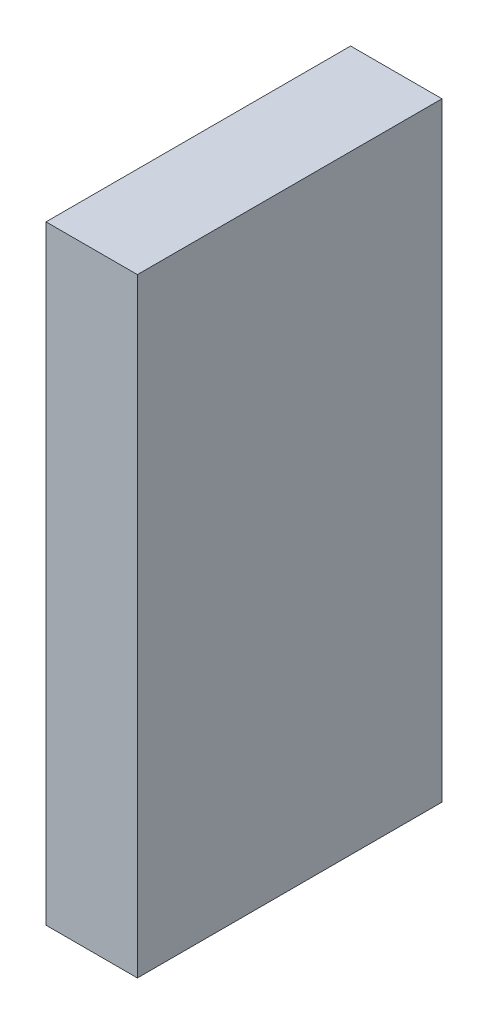
ISO-10303-21;
HEADER;
FILE_DESCRIPTION(('STEP AP214'),'2;1');
FILE_NAME('part.step','',(''),(''),'','','');
FILE_SCHEMA(('AUTOMOTIVE_DESIGN { 1 0 10303 214 1 1 1 1 }'));
ENDSEC;
DATA;
#1=APPLICATION_CONTEXT('core data for automotive mechanical design processes');
#2=APPLICATION_PROTOCOL_DEFINITION('international standard','automotive_design',2000,#1);
#3=PRODUCT_CONTEXT('',#1,'mechanical');
#4=PRODUCT('Part','Part','',(#3));
#5=PRODUCT_RELATED_PRODUCT_CATEGORY('part','',(#4));
#6=PRODUCT_DEFINITION_FORMATION('','',#4);
#7=PRODUCT_DEFINITION_CONTEXT('part definition',#1,'design');
#8=PRODUCT_DEFINITION('design','',#6,#7);
#9=PRODUCT_DEFINITION_SHAPE('','',#8);
#10=(LENGTH_UNIT() NAMED_UNIT(*) SI_UNIT(.MILLI.,.METRE.));
#11=(NAMED_UNIT(*) PLANE_ANGLE_UNIT() SI_UNIT($,.RADIAN.));
#12=(NAMED_UNIT(*) SI_UNIT($,.STERADIAN.) SOLID_ANGLE_UNIT());
#13=UNCERTAINTY_MEASURE_WITH_UNIT(LENGTH_MEASURE(1.E-05),#10,'distance_accuracy_value','');
#14=(GEOMETRIC_REPRESENTATION_CONTEXT(3) GLOBAL_UNCERTAINTY_ASSIGNED_CONTEXT((#13)) GLOBAL_UNIT_ASSIGNED_CONTEXT((#10,
#11,#12)) REPRESENTATION_CONTEXT('',''));
#15=CARTESIAN_POINT('',(0.,0.,0.));
#16=DIRECTION('',(0.,0.,1.));
#17=DIRECTION('',(1.,0.,0.));
#18=AXIS2_PLACEMENT_3D('',#15,#16,#17);
#19=CARTESIAN_POINT('',(1.7,-1.,0.));
#20=DIRECTION('',(-1.,0.,0.));
#21=DIRECTION('',(0.,0.,1.));
#22=AXIS2_PLACEMENT_3D('',#19,#20,#21);
#23=PLANE('',#22);
#24=DIRECTION('',(0.,0.,1.));
#25=VECTOR('',#24,1.);
#26=CARTESIAN_POINT('',(1.7,1.,0.));
#27=LINE('',#26,#25);
#28=CARTESIAN_POINT('',(1.7,1.,0.));
#29=VERTEX_POINT('',#28);
#30=CARTESIAN_POINT('',(1.7,1.,1.));
#31=VERTEX_POINT('',#30);
#32=EDGE_CURVE('E20',#29,#31,#27,.T.);
#33=ORIENTED_EDGE('',*,*,#32,.F.);
#34=DIRECTION('',(0.,1.,0.));
#35=VECTOR('',#34,1.);
#36=CARTESIAN_POINT('',(1.7,0.,0.));
#37=LINE('',#36,#35);
#38=CARTESIAN_POINT('',(1.7,-1.,0.));
#39=VERTEX_POINT('',#38);
#40=EDGE_CURVE('E79',#29,#39,#37,.F.);
#41=ORIENTED_EDGE('',*,*,#40,.T.);
#42=DIRECTION('',(0.,0.,-1.));
#43=VECTOR('',#42,1.);
#44=CARTESIAN_POINT('',(1.7,-1.,0.));
#45=LINE('',#44,#43);
#46=CARTESIAN_POINT('',(1.7,-1.,1.));
#47=VERTEX_POINT('',#46);
#48=EDGE_CURVE('E61',#47,#39,#45,.T.);
#49=ORIENTED_EDGE('',*,*,#48,.F.);
#50=DIRECTION('',(0.,1.,0.));
#51=VECTOR('',#50,1.);
#52=CARTESIAN_POINT('',(1.7,0.,1.));
#53=LINE('',#52,#51);
#54=EDGE_CURVE('E56',#31,#47,#53,.F.);
#55=ORIENTED_EDGE('',*,*,#54,.F.);
#56=EDGE_LOOP('',(#33,#41,#49,#55));
#57=FACE_BOUND('',#56,.T.);
#58=ADVANCED_FACE('F17',(#57),#23,.T.);
#59=CARTESIAN_POINT('',(1.7,1.,0.));
#60=DIRECTION('',(0.,1.,0.));
#61=DIRECTION('',(0.,0.,1.));
#62=AXIS2_PLACEMENT_3D('',#59,#60,#61);
#63=PLANE('',#62);
#64=DIRECTION('',(0.,0.,-1.));
#65=VECTOR('',#64,1.);
#66=CARTESIAN_POINT('',(2.,1.,0.));
#67=LINE('',#66,#65);
#68=CARTESIAN_POINT('',(2.,1.,0.));
#69=VERTEX_POINT('',#68);
#70=CARTESIAN_POINT('',(2.,1.,1.));
#71=VERTEX_POINT('',#70);
#72=EDGE_CURVE('E83',#69,#71,#67,.F.);
#73=ORIENTED_EDGE('',*,*,#72,.F.);
#74=DIRECTION('',(1.,0.,0.));
#75=VECTOR('',#74,1.);
#76=CARTESIAN_POINT('',(1.85,1.,0.));
#77=LINE('',#76,#75);
#78=EDGE_CURVE('E68',#69,#29,#77,.F.);
#79=ORIENTED_EDGE('',*,*,#78,.T.);
#80=ORIENTED_EDGE('',*,*,#32,.T.);
#81=DIRECTION('',(1.,0.,0.));
#82=VECTOR('',#81,1.);
#83=CARTESIAN_POINT('',(1.85,1.,1.));
#84=LINE('',#83,#82);
#85=EDGE_CURVE('E63',#71,#31,#84,.F.);
#86=ORIENTED_EDGE('',*,*,#85,.F.);
#87=EDGE_LOOP('',(#73,#79,#80,#86));
#88=FACE_BOUND('',#87,.T.);
#89=ADVANCED_FACE('F65',(#88),#63,.T.);
#90=CARTESIAN_POINT('',(1.85,0.,1.));
#91=DIRECTION('',(0.,0.,1.));
#92=DIRECTION('',(1.,0.,0.));
#93=AXIS2_PLACEMENT_3D('',#90,#91,#92);
#94=PLANE('',#93);
#95=DIRECTION('',(0.,1.,0.));
#96=VECTOR('',#95,1.);
#97=CARTESIAN_POINT('',(2.,1.,1.));
#98=LINE('',#97,#96);
#99=CARTESIAN_POINT('',(2.,-1.,1.));
#100=VERTEX_POINT('',#99);
#101=EDGE_CURVE('E72',#71,#100,#98,.F.);
#102=ORIENTED_EDGE('',*,*,#101,.F.);
#103=ORIENTED_EDGE('',*,*,#85,.T.);
#104=ORIENTED_EDGE('',*,*,#54,.T.);
#105=DIRECTION('',(1.,0.,0.));
#106=VECTOR('',#105,1.);
#107=CARTESIAN_POINT('',(2.,-1.,1.));
#108=LINE('',#107,#106);
#109=EDGE_CURVE('E74',#100,#47,#108,.F.);
#110=ORIENTED_EDGE('',*,*,#109,.F.);
#111=EDGE_LOOP('',(#102,#103,#104,#110));
#112=FACE_BOUND('',#111,.T.);
#113=ADVANCED_FACE('F70',(#112),#94,.T.);
#114=CARTESIAN_POINT('',(2.,-1.,0.));
#115=DIRECTION('',(0.,-1.,0.));
#116=DIRECTION('',(0.,0.,-1.));
#117=AXIS2_PLACEMENT_3D('',#114,#115,#116);
#118=PLANE('',#117);
#119=ORIENTED_EDGE('',*,*,#48,.T.);
#120=DIRECTION('',(1.,0.,0.));
#121=VECTOR('',#120,1.);
#122=CARTESIAN_POINT('',(1.85,-1.,0.));
#123=LINE('',#122,#121);
#124=CARTESIAN_POINT('',(2.,-1.,0.));
#125=VERTEX_POINT('',#124);
#126=EDGE_CURVE('E35',#39,#125,#123,.T.);
#127=ORIENTED_EDGE('',*,*,#126,.T.);
#128=DIRECTION('',(0.,0.,-1.));
#129=VECTOR('',#128,1.);
#130=CARTESIAN_POINT('',(2.,-1.,0.));
#131=LINE('',#130,#129);
#132=EDGE_CURVE('E26',#100,#125,#131,.T.);
#133=ORIENTED_EDGE('',*,*,#132,.F.);
#134=ORIENTED_EDGE('',*,*,#109,.T.);
#135=EDGE_LOOP('',(#119,#127,#133,#134));
#136=FACE_BOUND('',#135,.T.);
#137=ADVANCED_FACE('F89',(#136),#118,.T.);
#138=CARTESIAN_POINT('',(1.85,0.,0.));
#139=DIRECTION('',(0.,0.,1.));
#140=DIRECTION('',(1.,0.,0.));
#141=AXIS2_PLACEMENT_3D('',#138,#139,#140);
#142=PLANE('',#141);
#143=DIRECTION('',(0.,1.,0.));
#144=VECTOR('',#143,1.);
#145=CARTESIAN_POINT('',(2.,1.,0.));
#146=LINE('',#145,#144);
#147=EDGE_CURVE('E11',#125,#69,#146,.T.);
#148=ORIENTED_EDGE('',*,*,#147,.F.);
#149=ORIENTED_EDGE('',*,*,#126,.F.);
#150=ORIENTED_EDGE('',*,*,#40,.F.);
#151=ORIENTED_EDGE('',*,*,#78,.F.);
#152=EDGE_LOOP('',(#148,#149,#150,#151));
#153=FACE_BOUND('',#152,.T.);
#154=ADVANCED_FACE('F91',(#153),#142,.F.);
#155=CARTESIAN_POINT('',(2.,1.,0.));
#156=DIRECTION('',(1.,0.,0.));
#157=DIRECTION('',(0.,0.,-1.));
#158=AXIS2_PLACEMENT_3D('',#155,#156,#157);
#159=PLANE('',#158);
#160=ORIENTED_EDGE('',*,*,#132,.T.);
#161=ORIENTED_EDGE('',*,*,#147,.T.);
#162=ORIENTED_EDGE('',*,*,#72,.T.);
#163=ORIENTED_EDGE('',*,*,#101,.T.);
#164=EDGE_LOOP('',(#160,#161,#162,#163));
#165=FACE_BOUND('',#164,.T.);
#166=ADVANCED_FACE('F88',(#165),#159,.T.);
#167=CLOSED_SHELL('',(#58,#89,#113,#137,#154,#166));
#168=MANIFOLD_SOLID_BREP('B1',#167);
#169=ADVANCED_BREP_SHAPE_REPRESENTATION('',(#18,#168),#14);
#170=SHAPE_DEFINITION_REPRESENTATION(#9,#169);
ENDSEC;
END-ISO-10303-21;
